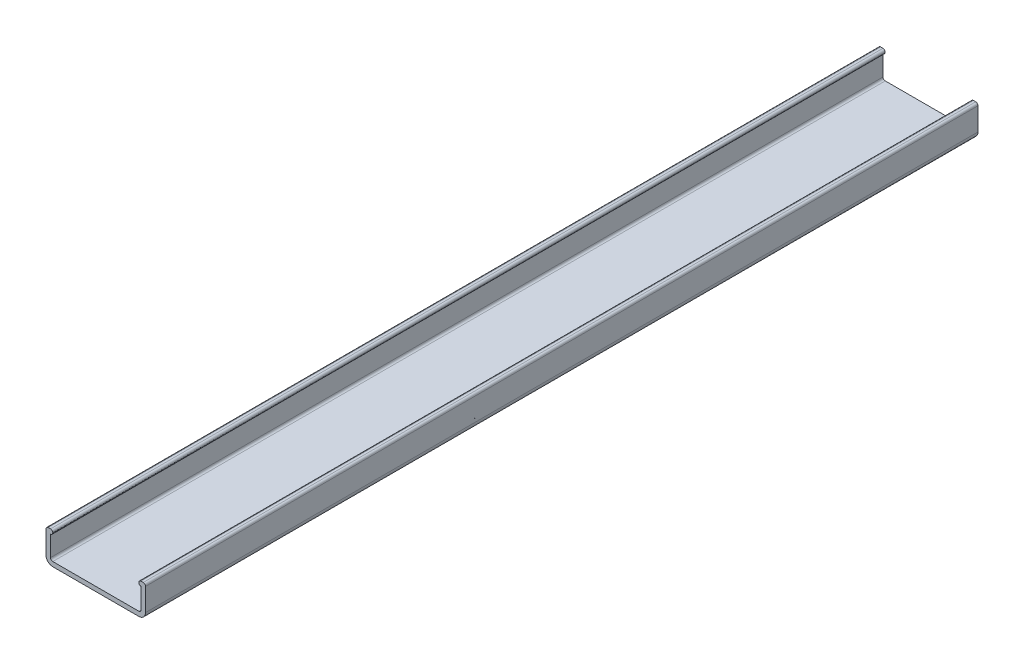
ISO-10303-21;
HEADER;
FILE_DESCRIPTION(('STEP AP214'),'2;1');
FILE_NAME('part.step','',(''),(''),'','','');
FILE_SCHEMA(('AUTOMOTIVE_DESIGN { 1 0 10303 214 1 1 1 1 }'));
ENDSEC;
DATA;
#1=APPLICATION_CONTEXT('core data for automotive mechanical design processes');
#2=APPLICATION_PROTOCOL_DEFINITION('international standard','automotive_design',2000,#1);
#3=PRODUCT_CONTEXT('',#1,'mechanical');
#4=PRODUCT('Part','Part','',(#3));
#5=PRODUCT_RELATED_PRODUCT_CATEGORY('part','',(#4));
#6=PRODUCT_DEFINITION_FORMATION('','',#4);
#7=PRODUCT_DEFINITION_CONTEXT('part definition',#1,'design');
#8=PRODUCT_DEFINITION('design','',#6,#7);
#9=PRODUCT_DEFINITION_SHAPE('','',#8);
#10=(LENGTH_UNIT() NAMED_UNIT(*) SI_UNIT(.MILLI.,.METRE.));
#11=(NAMED_UNIT(*) PLANE_ANGLE_UNIT() SI_UNIT($,.RADIAN.));
#12=(NAMED_UNIT(*) SI_UNIT($,.STERADIAN.) SOLID_ANGLE_UNIT());
#13=UNCERTAINTY_MEASURE_WITH_UNIT(LENGTH_MEASURE(1.E-05),#10,'distance_accuracy_value','');
#14=(GEOMETRIC_REPRESENTATION_CONTEXT(3) GLOBAL_UNCERTAINTY_ASSIGNED_CONTEXT((#13)) GLOBAL_UNIT_ASSIGNED_CONTEXT((#10,
#11,#12)) REPRESENTATION_CONTEXT('',''));
#15=CARTESIAN_POINT('',(0.,0.,0.));
#16=DIRECTION('',(0.,0.,1.));
#17=DIRECTION('',(1.,0.,0.));
#18=AXIS2_PLACEMENT_3D('',#15,#16,#17);
#19=CARTESIAN_POINT('',(-17.4625,11.1125,292.1));
#20=DIRECTION('',(0.,-1.,0.));
#21=DIRECTION('',(0.,0.,-1.));
#22=AXIS2_PLACEMENT_3D('',#19,#20,#21);
#23=PLANE('',#22);
#24=DIRECTION('',(-1.,0.,0.));
#25=VECTOR('',#24,1.);
#26=CARTESIAN_POINT('',(-17.4625,11.1125,292.1));
#27=LINE('',#26,#25);
#28=CARTESIAN_POINT('',(-15.875,11.1125,292.1));
#29=VERTEX_POINT('',#28);
#30=CARTESIAN_POINT('',(-16.66875,11.1125,292.1));
#31=VERTEX_POINT('',#30);
#32=EDGE_CURVE('E299',#29,#31,#27,.T.);
#33=ORIENTED_EDGE('',*,*,#32,.F.);
#34=DIRECTION('',(0.,0.,-1.));
#35=VECTOR('',#34,1.);
#36=CARTESIAN_POINT('',(-15.875,11.1125,292.1));
#37=LINE('',#36,#35);
#38=CARTESIAN_POINT('',(-15.875,11.1125,0.));
#39=VERTEX_POINT('',#38);
#40=EDGE_CURVE('E215',#29,#39,#37,.T.);
#41=ORIENTED_EDGE('',*,*,#40,.T.);
#42=DIRECTION('',(-1.,0.,0.));
#43=VECTOR('',#42,1.);
#44=CARTESIAN_POINT('',(-17.4625,11.1125,0.));
#45=LINE('',#44,#43);
#46=CARTESIAN_POINT('',(-16.66875,11.1125,0.));
#47=VERTEX_POINT('',#46);
#48=EDGE_CURVE('E250',#39,#47,#45,.T.);
#49=ORIENTED_EDGE('',*,*,#48,.T.);
#50=DIRECTION('',(0.,0.,-1.));
#51=VECTOR('',#50,1.);
#52=CARTESIAN_POINT('',(-16.66875,11.1125,292.1));
#53=LINE('',#52,#51);
#54=EDGE_CURVE('E213',#47,#31,#53,.F.);
#55=ORIENTED_EDGE('',*,*,#54,.T.);
#56=EDGE_LOOP('',(#33,#41,#49,#55));
#57=FACE_BOUND('',#56,.T.);
#58=ADVANCED_FACE('F33',(#57),#23,.F.);
#59=CARTESIAN_POINT('',(-17.4625,11.1125,292.1));
#60=DIRECTION('',(1.,0.,0.));
#61=DIRECTION('',(0.,1.,0.));
#62=AXIS2_PLACEMENT_3D('',#59,#60,#61);
#63=PLANE('',#62);
#64=DIRECTION('',(0.,-1.,0.));
#65=VECTOR('',#64,1.);
#66=CARTESIAN_POINT('',(-17.4625,11.1125,0.));
#67=LINE('',#66,#65);
#68=CARTESIAN_POINT('',(-17.4625,10.31875,0.));
#69=VERTEX_POINT('',#68);
#70=CARTESIAN_POINT('',(-17.4625,2.3495,0.));
#71=VERTEX_POINT('',#70);
#72=EDGE_CURVE('E284',#69,#71,#67,.T.);
#73=ORIENTED_EDGE('',*,*,#72,.T.);
#74=DIRECTION('',(0.,0.,-1.));
#75=VECTOR('',#74,1.);
#76=CARTESIAN_POINT('',(-17.4625,2.3495,292.1));
#77=LINE('',#76,#75);
#78=CARTESIAN_POINT('',(-17.4625,2.3495,292.1));
#79=VERTEX_POINT('',#78);
#80=EDGE_CURVE('E11',#71,#79,#77,.F.);
#81=ORIENTED_EDGE('',*,*,#80,.T.);
#82=DIRECTION('',(0.,-1.,0.));
#83=VECTOR('',#82,1.);
#84=CARTESIAN_POINT('',(-17.4625,11.1125,292.1));
#85=LINE('',#84,#83);
#86=CARTESIAN_POINT('',(-17.4625,10.31875,292.1));
#87=VERTEX_POINT('',#86);
#88=EDGE_CURVE('E304',#87,#79,#85,.T.);
#89=ORIENTED_EDGE('',*,*,#88,.F.);
#90=DIRECTION('',(0.,0.,-1.));
#91=VECTOR('',#90,1.);
#92=CARTESIAN_POINT('',(-17.4625,10.31875,292.1));
#93=LINE('',#92,#91);
#94=EDGE_CURVE('E217',#87,#69,#93,.T.);
#95=ORIENTED_EDGE('',*,*,#94,.T.);
#96=EDGE_LOOP('',(#73,#81,#89,#95));
#97=FACE_BOUND('',#96,.T.);
#98=ADVANCED_FACE('F325',(#97),#63,.F.);
#99=CARTESIAN_POINT('',(-17.4625,0.,292.1));
#100=DIRECTION('',(0.,1.,0.));
#101=DIRECTION('',(0.,0.,1.));
#102=AXIS2_PLACEMENT_3D('',#99,#100,#101);
#103=PLANE('',#102);
#104=DIRECTION('',(1.,0.,0.));
#105=VECTOR('',#104,1.);
#106=CARTESIAN_POINT('',(-17.4625,0.,0.));
#107=LINE('',#106,#105);
#108=CARTESIAN_POINT('',(-15.113,0.,0.));
#109=VERTEX_POINT('',#108);
#110=CARTESIAN_POINT('',(15.113,0.,0.));
#111=VERTEX_POINT('',#110);
#112=EDGE_CURVE('E280',#109,#111,#107,.T.);
#113=ORIENTED_EDGE('',*,*,#112,.T.);
#114=DIRECTION('',(0.,0.,-1.));
#115=VECTOR('',#114,1.);
#116=CARTESIAN_POINT('',(15.113,0.,292.1));
#117=LINE('',#116,#115);
#118=CARTESIAN_POINT('',(15.113,0.,292.1));
#119=VERTEX_POINT('',#118);
#120=EDGE_CURVE('E54',#111,#119,#117,.F.);
#121=ORIENTED_EDGE('',*,*,#120,.T.);
#122=DIRECTION('',(1.,0.,0.));
#123=VECTOR('',#122,1.);
#124=CARTESIAN_POINT('',(-17.4625,0.,292.1));
#125=LINE('',#124,#123);
#126=CARTESIAN_POINT('',(-15.113,0.,292.1));
#127=VERTEX_POINT('',#126);
#128=EDGE_CURVE('E267',#127,#119,#125,.T.);
#129=ORIENTED_EDGE('',*,*,#128,.F.);
#130=DIRECTION('',(0.,0.,-1.));
#131=VECTOR('',#130,1.);
#132=CARTESIAN_POINT('',(-15.113,0.,292.1));
#133=LINE('',#132,#131);
#134=EDGE_CURVE('E259',#127,#109,#133,.T.);
#135=ORIENTED_EDGE('',*,*,#134,.T.);
#136=EDGE_LOOP('',(#113,#121,#129,#135));
#137=FACE_BOUND('',#136,.T.);
#138=ADVANCED_FACE('F282',(#137),#103,.F.);
#139=CARTESIAN_POINT('',(17.4625,0.,292.1));
#140=DIRECTION('',(-1.,0.,0.));
#141=DIRECTION('',(0.,-1.,0.));
#142=AXIS2_PLACEMENT_3D('',#139,#140,#141);
#143=PLANE('',#142);
#144=DIRECTION('',(0.,1.,0.));
#145=VECTOR('',#144,1.);
#146=CARTESIAN_POINT('',(17.4625,0.,292.1));
#147=LINE('',#146,#145);
#148=CARTESIAN_POINT('',(17.4625,2.3495,292.1));
#149=VERTEX_POINT('',#148);
#150=CARTESIAN_POINT('',(17.4625,10.31875,292.1));
#151=VERTEX_POINT('',#150);
#152=EDGE_CURVE('E266',#149,#151,#147,.T.);
#153=ORIENTED_EDGE('',*,*,#152,.F.);
#154=DIRECTION('',(0.,0.,-1.));
#155=VECTOR('',#154,1.);
#156=CARTESIAN_POINT('',(17.4625,2.3495,292.1));
#157=LINE('',#156,#155);
#158=CARTESIAN_POINT('',(17.4625,2.3495,0.));
#159=VERTEX_POINT('',#158);
#160=EDGE_CURVE('E246',#149,#159,#157,.T.);
#161=ORIENTED_EDGE('',*,*,#160,.T.);
#162=DIRECTION('',(0.,1.,0.));
#163=VECTOR('',#162,1.);
#164=CARTESIAN_POINT('',(17.4625,0.,0.));
#165=LINE('',#164,#163);
#166=CARTESIAN_POINT('',(17.4625,10.31875,0.));
#167=VERTEX_POINT('',#166);
#168=EDGE_CURVE('E281',#159,#167,#165,.T.);
#169=ORIENTED_EDGE('',*,*,#168,.T.);
#170=DIRECTION('',(0.,0.,-1.));
#171=VECTOR('',#170,1.);
#172=CARTESIAN_POINT('',(17.4625,10.31875,292.1));
#173=LINE('',#172,#171);
#174=EDGE_CURVE('E226',#167,#151,#173,.F.);
#175=ORIENTED_EDGE('',*,*,#174,.T.);
#176=EDGE_LOOP('',(#153,#161,#169,#175));
#177=FACE_BOUND('',#176,.T.);
#178=ADVANCED_FACE('F271',(#177),#143,.F.);
#179=CARTESIAN_POINT('',(15.08125,11.1125,292.1));
#180=DIRECTION('',(0.,-1.,0.));
#181=DIRECTION('',(0.,0.,-1.));
#182=AXIS2_PLACEMENT_3D('',#179,#180,#181);
#183=PLANE('',#182);
#184=DIRECTION('',(-1.,0.,0.));
#185=VECTOR('',#184,1.);
#186=CARTESIAN_POINT('',(15.08125,11.1125,292.1));
#187=LINE('',#186,#185);
#188=CARTESIAN_POINT('',(16.66875,11.1125,292.1));
#189=VERTEX_POINT('',#188);
#190=CARTESIAN_POINT('',(15.875,11.1125,292.1));
#191=VERTEX_POINT('',#190);
#192=EDGE_CURVE('E181',#189,#191,#187,.T.);
#193=ORIENTED_EDGE('',*,*,#192,.F.);
#194=DIRECTION('',(0.,0.,-1.));
#195=VECTOR('',#194,1.);
#196=CARTESIAN_POINT('',(16.66875,11.1125,292.1));
#197=LINE('',#196,#195);
#198=CARTESIAN_POINT('',(16.66875,11.1125,0.));
#199=VERTEX_POINT('',#198);
#200=EDGE_CURVE('E223',#189,#199,#197,.T.);
#201=ORIENTED_EDGE('',*,*,#200,.T.);
#202=DIRECTION('',(-1.,0.,0.));
#203=VECTOR('',#202,1.);
#204=CARTESIAN_POINT('',(15.08125,11.1125,0.));
#205=LINE('',#204,#203);
#206=CARTESIAN_POINT('',(15.875,11.1125,0.));
#207=VERTEX_POINT('',#206);
#208=EDGE_CURVE('E286',#199,#207,#205,.T.);
#209=ORIENTED_EDGE('',*,*,#208,.T.);
#210=DIRECTION('',(0.,0.,-1.));
#211=VECTOR('',#210,1.);
#212=CARTESIAN_POINT('',(15.875,11.1125,292.1));
#213=LINE('',#212,#211);
#214=EDGE_CURVE('E220',#207,#191,#213,.F.);
#215=ORIENTED_EDGE('',*,*,#214,.T.);
#216=EDGE_LOOP('',(#193,#201,#209,#215));
#217=FACE_BOUND('',#216,.T.);
#218=ADVANCED_FACE('F387',(#217),#183,.F.);
#219=CARTESIAN_POINT('',(15.875,1.5875,292.1));
#220=DIRECTION('',(1.,0.,0.));
#221=DIRECTION('',(0.,1.,0.));
#222=AXIS2_PLACEMENT_3D('',#219,#220,#221);
#223=PLANE('',#222);
#224=DIRECTION('',(0.,-1.,0.));
#225=VECTOR('',#224,1.);
#226=CARTESIAN_POINT('',(15.875,1.5875,0.));
#227=LINE('',#226,#225);
#228=CARTESIAN_POINT('',(15.875,9.525,0.));
#229=VERTEX_POINT('',#228);
#230=CARTESIAN_POINT('',(15.875,2.38125,0.));
#231=VERTEX_POINT('',#230);
#232=EDGE_CURVE('E293',#229,#231,#227,.T.);
#233=ORIENTED_EDGE('',*,*,#232,.T.);
#234=DIRECTION('',(0.,0.,-1.));
#235=VECTOR('',#234,1.);
#236=CARTESIAN_POINT('',(15.875,2.38125,292.1));
#237=LINE('',#236,#235);
#238=CARTESIAN_POINT('',(15.875,2.38125,292.1));
#239=VERTEX_POINT('',#238);
#240=EDGE_CURVE('E179',#231,#239,#237,.F.);
#241=ORIENTED_EDGE('',*,*,#240,.T.);
#242=DIRECTION('',(0.,-1.,0.));
#243=VECTOR('',#242,1.);
#244=CARTESIAN_POINT('',(15.875,1.5875,292.1));
#245=LINE('',#244,#243);
#246=CARTESIAN_POINT('',(15.875,9.525,292.1));
#247=VERTEX_POINT('',#246);
#248=EDGE_CURVE('E163',#247,#239,#245,.T.);
#249=ORIENTED_EDGE('',*,*,#248,.F.);
#250=DIRECTION('',(0.,0.,-1.));
#251=VECTOR('',#250,1.);
#252=CARTESIAN_POINT('',(15.875,9.525,292.1));
#253=LINE('',#252,#251);
#254=EDGE_CURVE('E176',#247,#229,#253,.T.);
#255=ORIENTED_EDGE('',*,*,#254,.T.);
#256=EDGE_LOOP('',(#233,#241,#249,#255));
#257=FACE_BOUND('',#256,.T.);
#258=ADVANCED_FACE('F175',(#257),#223,.F.);
#259=CARTESIAN_POINT('',(-15.875,1.5875,292.1));
#260=DIRECTION('',(0.,-1.,0.));
#261=DIRECTION('',(0.,0.,-1.));
#262=AXIS2_PLACEMENT_3D('',#259,#260,#261);
#263=PLANE('',#262);
#264=DIRECTION('',(-1.,0.,0.));
#265=VECTOR('',#264,1.);
#266=CARTESIAN_POINT('',(-15.875,1.5875,292.1));
#267=LINE('',#266,#265);
#268=CARTESIAN_POINT('',(15.08125,1.5875,292.1));
#269=VERTEX_POINT('',#268);
#270=CARTESIAN_POINT('',(-15.08125,1.5875,292.1));
#271=VERTEX_POINT('',#270);
#272=EDGE_CURVE('E180',#269,#271,#267,.T.);
#273=ORIENTED_EDGE('',*,*,#272,.F.);
#274=DIRECTION('',(0.,0.,-1.));
#275=VECTOR('',#274,1.);
#276=CARTESIAN_POINT('',(15.08125,1.5875,0.));
#277=LINE('',#276,#275);
#278=CARTESIAN_POINT('',(15.08125,1.5875,0.));
#279=VERTEX_POINT('',#278);
#280=EDGE_CURVE('E231',#269,#279,#277,.T.);
#281=ORIENTED_EDGE('',*,*,#280,.T.);
#282=DIRECTION('',(-1.,0.,0.));
#283=VECTOR('',#282,1.);
#284=CARTESIAN_POINT('',(-15.875,1.5875,0.));
#285=LINE('',#284,#283);
#286=CARTESIAN_POINT('',(-15.08125,1.5875,0.));
#287=VERTEX_POINT('',#286);
#288=EDGE_CURVE('E295',#279,#287,#285,.T.);
#289=ORIENTED_EDGE('',*,*,#288,.T.);
#290=DIRECTION('',(0.,0.,-1.));
#291=VECTOR('',#290,1.);
#292=CARTESIAN_POINT('',(-15.08125,1.5875,292.1));
#293=LINE('',#292,#291);
#294=EDGE_CURVE('E229',#287,#271,#293,.F.);
#295=ORIENTED_EDGE('',*,*,#294,.T.);
#296=EDGE_LOOP('',(#273,#281,#289,#295));
#297=FACE_BOUND('',#296,.T.);
#298=ADVANCED_FACE('F380',(#297),#263,.F.);
#299=CARTESIAN_POINT('',(-15.875,9.525,292.1));
#300=DIRECTION('',(-1.,0.,0.));
#301=DIRECTION('',(0.,-1.,0.));
#302=AXIS2_PLACEMENT_3D('',#299,#300,#301);
#303=PLANE('',#302);
#304=DIRECTION('',(0.,1.,0.));
#305=VECTOR('',#304,1.);
#306=CARTESIAN_POINT('',(-15.875,9.525,292.1));
#307=LINE('',#306,#305);
#308=CARTESIAN_POINT('',(-15.875,2.38125,292.1));
#309=VERTEX_POINT('',#308);
#310=CARTESIAN_POINT('',(-15.875,9.525,292.1));
#311=VERTEX_POINT('',#310);
#312=EDGE_CURVE('E191',#309,#311,#307,.T.);
#313=ORIENTED_EDGE('',*,*,#312,.F.);
#314=DIRECTION('',(0.,0.,-1.));
#315=VECTOR('',#314,1.);
#316=CARTESIAN_POINT('',(-15.875,2.38125,0.));
#317=LINE('',#316,#315);
#318=CARTESIAN_POINT('',(-15.875,2.38125,0.));
#319=VERTEX_POINT('',#318);
#320=EDGE_CURVE('E235',#309,#319,#317,.T.);
#321=ORIENTED_EDGE('',*,*,#320,.T.);
#322=DIRECTION('',(0.,1.,0.));
#323=VECTOR('',#322,1.);
#324=CARTESIAN_POINT('',(-15.875,9.525,0.));
#325=LINE('',#324,#323);
#326=CARTESIAN_POINT('',(-15.875,9.525,0.));
#327=VERTEX_POINT('',#326);
#328=EDGE_CURVE('E297',#319,#327,#325,.T.);
#329=ORIENTED_EDGE('',*,*,#328,.T.);
#330=DIRECTION('',(0.,0.,-1.));
#331=VECTOR('',#330,1.);
#332=CARTESIAN_POINT('',(-15.875,9.525,292.1));
#333=LINE('',#332,#331);
#334=EDGE_CURVE('E186',#311,#327,#333,.T.);
#335=ORIENTED_EDGE('',*,*,#334,.F.);
#336=EDGE_LOOP('',(#313,#321,#329,#335));
#337=FACE_BOUND('',#336,.T.);
#338=ADVANCED_FACE('F374',(#337),#303,.F.);
#339=CARTESIAN_POINT('',(0.,0.,292.1));
#340=DIRECTION('',(0.,0.,-1.));
#341=DIRECTION('',(-1.,0.,0.));
#342=AXIS2_PLACEMENT_3D('',#339,#340,#341);
#343=PLANE('',#342);
#344=ORIENTED_EDGE('',*,*,#128,.T.);
#345=CARTESIAN_POINT('',(15.113,2.3495,292.1));
#346=DIRECTION('',(0.,0.,-1.));
#347=DIRECTION('',(-1.,0.,0.));
#348=AXIS2_PLACEMENT_3D('',#345,#346,#347);
#349=CIRCLE('',#348,2.3495);
#350=EDGE_CURVE('E41',#119,#149,#349,.F.);
#351=ORIENTED_EDGE('',*,*,#350,.T.);
#352=ORIENTED_EDGE('',*,*,#152,.T.);
#353=CARTESIAN_POINT('',(16.66875,10.31875,292.1));
#354=DIRECTION('',(0.,0.,-1.));
#355=DIRECTION('',(-1.,0.,0.));
#356=AXIS2_PLACEMENT_3D('',#353,#354,#355);
#357=CIRCLE('',#356,0.79375);
#358=EDGE_CURVE('E205',#151,#189,#357,.F.);
#359=ORIENTED_EDGE('',*,*,#358,.T.);
#360=ORIENTED_EDGE('',*,*,#192,.T.);
#361=CARTESIAN_POINT('',(15.875,10.31875,292.1));
#362=DIRECTION('',(0.,0.,-1.));
#363=DIRECTION('',(-1.,0.,0.));
#364=AXIS2_PLACEMENT_3D('',#361,#362,#363);
#365=CIRCLE('',#364,0.79375);
#366=CARTESIAN_POINT('',(15.08125,10.31875,292.1));
#367=VERTEX_POINT('',#366);
#368=EDGE_CURVE('E166',#191,#367,#365,.F.);
#369=ORIENTED_EDGE('',*,*,#368,.T.);
#370=CARTESIAN_POINT('',(15.875,10.31875,292.1));
#371=DIRECTION('',(0.,0.,-1.));
#372=DIRECTION('',(-1.,0.,0.));
#373=AXIS2_PLACEMENT_3D('',#370,#371,#372);
#374=CIRCLE('',#373,0.79375);
#375=EDGE_CURVE('E160',#367,#247,#374,.F.);
#376=ORIENTED_EDGE('',*,*,#375,.T.);
#377=ORIENTED_EDGE('',*,*,#248,.T.);
#378=CARTESIAN_POINT('',(15.08125,2.38125,292.1));
#379=DIRECTION('',(0.,0.,-1.));
#380=DIRECTION('',(-1.,0.,0.));
#381=AXIS2_PLACEMENT_3D('',#378,#379,#380);
#382=CIRCLE('',#381,0.79375);
#383=EDGE_CURVE('E240',#239,#269,#382,.T.);
#384=ORIENTED_EDGE('',*,*,#383,.T.);
#385=ORIENTED_EDGE('',*,*,#272,.T.);
#386=CARTESIAN_POINT('',(-15.08125,2.38125,292.1));
#387=DIRECTION('',(0.,0.,-1.));
#388=DIRECTION('',(-1.,0.,0.));
#389=AXIS2_PLACEMENT_3D('',#386,#387,#388);
#390=CIRCLE('',#389,0.79375);
#391=EDGE_CURVE('E244',#271,#309,#390,.T.);
#392=ORIENTED_EDGE('',*,*,#391,.T.);
#393=ORIENTED_EDGE('',*,*,#312,.T.);
#394=CARTESIAN_POINT('',(-15.875,10.31875,292.1));
#395=DIRECTION('',(0.,0.,-1.));
#396=DIRECTION('',(-1.,0.,0.));
#397=AXIS2_PLACEMENT_3D('',#394,#395,#396);
#398=CIRCLE('',#397,0.79375);
#399=CARTESIAN_POINT('',(-15.08125,10.31875,292.1));
#400=VERTEX_POINT('',#399);
#401=EDGE_CURVE('E211',#311,#400,#398,.F.);
#402=ORIENTED_EDGE('',*,*,#401,.T.);
#403=CARTESIAN_POINT('',(-15.875,10.31875,292.1));
#404=DIRECTION('',(0.,0.,-1.));
#405=DIRECTION('',(-1.,0.,0.));
#406=AXIS2_PLACEMENT_3D('',#403,#404,#405);
#407=CIRCLE('',#406,0.79375);
#408=EDGE_CURVE('E209',#400,#29,#407,.F.);
#409=ORIENTED_EDGE('',*,*,#408,.T.);
#410=ORIENTED_EDGE('',*,*,#32,.T.);
#411=CARTESIAN_POINT('',(-16.66875,10.31875,292.1));
#412=DIRECTION('',(0.,0.,-1.));
#413=DIRECTION('',(-1.,0.,0.));
#414=AXIS2_PLACEMENT_3D('',#411,#412,#413);
#415=CIRCLE('',#414,0.79375);
#416=EDGE_CURVE('E207',#31,#87,#415,.F.);
#417=ORIENTED_EDGE('',*,*,#416,.T.);
#418=ORIENTED_EDGE('',*,*,#88,.T.);
#419=CARTESIAN_POINT('',(-15.113,2.3495,292.1));
#420=DIRECTION('',(0.,0.,-1.));
#421=DIRECTION('',(-1.,0.,0.));
#422=AXIS2_PLACEMENT_3D('',#419,#420,#421);
#423=CIRCLE('',#422,2.3495);
#424=EDGE_CURVE('E263',#79,#127,#423,.F.);
#425=ORIENTED_EDGE('',*,*,#424,.T.);
#426=EDGE_LOOP('',(#344,#351,#352,#359,#360,#369,#376,#377,#384,#385,#392,#393,#402,#409,#410,
#417,#418,#425));
#427=FACE_BOUND('',#426,.T.);
#428=ADVANCED_FACE('F162',(#427),#343,.F.);
#429=CARTESIAN_POINT('',(0.,0.,0.));
#430=DIRECTION('',(0.,0.,-1.));
#431=DIRECTION('',(-1.,0.,0.));
#432=AXIS2_PLACEMENT_3D('',#429,#430,#431);
#433=PLANE('',#432);
#434=ORIENTED_EDGE('',*,*,#168,.F.);
#435=CARTESIAN_POINT('',(15.113,2.3495,0.));
#436=DIRECTION('',(0.,0.,-1.));
#437=DIRECTION('',(-1.,0.,0.));
#438=AXIS2_PLACEMENT_3D('',#435,#436,#437);
#439=CIRCLE('',#438,2.3495);
#440=EDGE_CURVE('E257',#159,#111,#439,.T.);
#441=ORIENTED_EDGE('',*,*,#440,.T.);
#442=ORIENTED_EDGE('',*,*,#112,.F.);
#443=CARTESIAN_POINT('',(-15.113,2.3495,0.));
#444=DIRECTION('',(0.,0.,-1.));
#445=DIRECTION('',(-1.,0.,0.));
#446=AXIS2_PLACEMENT_3D('',#443,#444,#445);
#447=CIRCLE('',#446,2.3495);
#448=EDGE_CURVE('E255',#109,#71,#447,.T.);
#449=ORIENTED_EDGE('',*,*,#448,.T.);
#450=ORIENTED_EDGE('',*,*,#72,.F.);
#451=CARTESIAN_POINT('',(-16.66875,10.31875,0.));
#452=DIRECTION('',(0.,0.,-1.));
#453=DIRECTION('',(-1.,0.,0.));
#454=AXIS2_PLACEMENT_3D('',#451,#452,#453);
#455=CIRCLE('',#454,0.79375);
#456=EDGE_CURVE('E199',#69,#47,#455,.T.);
#457=ORIENTED_EDGE('',*,*,#456,.T.);
#458=ORIENTED_EDGE('',*,*,#48,.F.);
#459=CARTESIAN_POINT('',(-15.875,10.31875,0.));
#460=DIRECTION('',(0.,0.,-1.));
#461=DIRECTION('',(-1.,0.,0.));
#462=AXIS2_PLACEMENT_3D('',#459,#460,#461);
#463=CIRCLE('',#462,0.79375);
#464=CARTESIAN_POINT('',(-15.08125,10.31875,0.));
#465=VERTEX_POINT('',#464);
#466=EDGE_CURVE('E201',#39,#465,#463,.T.);
#467=ORIENTED_EDGE('',*,*,#466,.T.);
#468=CARTESIAN_POINT('',(-15.875,10.31875,0.));
#469=DIRECTION('',(0.,0.,-1.));
#470=DIRECTION('',(-1.,0.,0.));
#471=AXIS2_PLACEMENT_3D('',#468,#469,#470);
#472=CIRCLE('',#471,0.79375);
#473=EDGE_CURVE('E171',#465,#327,#472,.T.);
#474=ORIENTED_EDGE('',*,*,#473,.T.);
#475=ORIENTED_EDGE('',*,*,#328,.F.);
#476=CARTESIAN_POINT('',(-15.08125,2.38125,0.));
#477=DIRECTION('',(0.,0.,-1.));
#478=DIRECTION('',(-1.,0.,0.));
#479=AXIS2_PLACEMENT_3D('',#476,#477,#478);
#480=CIRCLE('',#479,0.79375);
#481=EDGE_CURVE('E242',#319,#287,#480,.F.);
#482=ORIENTED_EDGE('',*,*,#481,.T.);
#483=ORIENTED_EDGE('',*,*,#288,.F.);
#484=CARTESIAN_POINT('',(15.08125,2.38125,0.));
#485=DIRECTION('',(0.,0.,-1.));
#486=DIRECTION('',(-1.,0.,0.));
#487=AXIS2_PLACEMENT_3D('',#484,#485,#486);
#488=CIRCLE('',#487,0.79375);
#489=EDGE_CURVE('E238',#279,#231,#488,.F.);
#490=ORIENTED_EDGE('',*,*,#489,.T.);
#491=ORIENTED_EDGE('',*,*,#232,.F.);
#492=CARTESIAN_POINT('',(15.875,10.31875,0.));
#493=DIRECTION('',(0.,0.,-1.));
#494=DIRECTION('',(-1.,0.,0.));
#495=AXIS2_PLACEMENT_3D('',#492,#493,#494);
#496=CIRCLE('',#495,0.79375);
#497=CARTESIAN_POINT('',(15.08125,10.31875,0.));
#498=VERTEX_POINT('',#497);
#499=EDGE_CURVE('E185',#229,#498,#496,.T.);
#500=ORIENTED_EDGE('',*,*,#499,.T.);
#501=CARTESIAN_POINT('',(15.875,10.31875,0.));
#502=DIRECTION('',(0.,0.,-1.));
#503=DIRECTION('',(-1.,0.,0.));
#504=AXIS2_PLACEMENT_3D('',#501,#502,#503);
#505=CIRCLE('',#504,0.79375);
#506=EDGE_CURVE('E188',#498,#207,#505,.T.);
#507=ORIENTED_EDGE('',*,*,#506,.T.);
#508=ORIENTED_EDGE('',*,*,#208,.F.);
#509=CARTESIAN_POINT('',(16.66875,10.31875,0.));
#510=DIRECTION('',(0.,0.,-1.));
#511=DIRECTION('',(-1.,0.,0.));
#512=AXIS2_PLACEMENT_3D('',#509,#510,#511);
#513=CIRCLE('',#512,0.79375);
#514=EDGE_CURVE('E196',#199,#167,#513,.T.);
#515=ORIENTED_EDGE('',*,*,#514,.T.);
#516=EDGE_LOOP('',(#434,#441,#442,#449,#450,#457,#458,#467,#474,#475,#482,#483,#490,#491,#500,
#507,#508,#515));
#517=FACE_BOUND('',#516,.T.);
#518=ADVANCED_FACE('F279',(#517),#433,.T.);
#519=CARTESIAN_POINT('',(-15.875,10.31875,292.1));
#520=DIRECTION('',(0.,0.,-1.));
#521=DIRECTION('',(-1.,0.,0.));
#522=AXIS2_PLACEMENT_3D('',#519,#520,#521);
#523=CYLINDRICAL_SURFACE('',#522,0.79375);
#524=ORIENTED_EDGE('',*,*,#40,.F.);
#525=ORIENTED_EDGE('',*,*,#408,.F.);
#526=DIRECTION('',(0.,0.,-1.));
#527=VECTOR('',#526,1.);
#528=CARTESIAN_POINT('',(-15.08125,10.31875,292.1));
#529=LINE('',#528,#527);
#530=EDGE_CURVE('E247',#465,#400,#529,.F.);
#531=ORIENTED_EDGE('',*,*,#530,.F.);
#532=ORIENTED_EDGE('',*,*,#466,.F.);
#533=EDGE_LOOP('',(#524,#525,#531,#532));
#534=FACE_BOUND('',#533,.T.);
#535=ADVANCED_FACE('F344',(#534),#523,.T.);
#536=CARTESIAN_POINT('',(-15.875,10.31875,292.1));
#537=DIRECTION('',(0.,0.,-1.));
#538=DIRECTION('',(-1.,0.,0.));
#539=AXIS2_PLACEMENT_3D('',#536,#537,#538);
#540=CYLINDRICAL_SURFACE('',#539,0.79375);
#541=ORIENTED_EDGE('',*,*,#401,.F.);
#542=ORIENTED_EDGE('',*,*,#334,.T.);
#543=ORIENTED_EDGE('',*,*,#473,.F.);
#544=ORIENTED_EDGE('',*,*,#530,.T.);
#545=EDGE_LOOP('',(#541,#542,#543,#544));
#546=FACE_BOUND('',#545,.T.);
#547=ADVANCED_FACE('F341',(#546),#540,.T.);
#548=CARTESIAN_POINT('',(-16.66875,10.31875,292.1));
#549=DIRECTION('',(0.,0.,-1.));
#550=DIRECTION('',(-1.,0.,0.));
#551=AXIS2_PLACEMENT_3D('',#548,#549,#550);
#552=CYLINDRICAL_SURFACE('',#551,0.79375);
#553=ORIENTED_EDGE('',*,*,#416,.F.);
#554=ORIENTED_EDGE('',*,*,#54,.F.);
#555=ORIENTED_EDGE('',*,*,#456,.F.);
#556=ORIENTED_EDGE('',*,*,#94,.F.);
#557=EDGE_LOOP('',(#553,#554,#555,#556));
#558=FACE_BOUND('',#557,.T.);
#559=ADVANCED_FACE('F322',(#558),#552,.T.);
#560=CARTESIAN_POINT('',(16.66875,10.31875,292.1));
#561=DIRECTION('',(0.,0.,-1.));
#562=DIRECTION('',(-1.,0.,0.));
#563=AXIS2_PLACEMENT_3D('',#560,#561,#562);
#564=CYLINDRICAL_SURFACE('',#563,0.79375);
#565=ORIENTED_EDGE('',*,*,#358,.F.);
#566=ORIENTED_EDGE('',*,*,#174,.F.);
#567=ORIENTED_EDGE('',*,*,#514,.F.);
#568=ORIENTED_EDGE('',*,*,#200,.F.);
#569=EDGE_LOOP('',(#565,#566,#567,#568));
#570=FACE_BOUND('',#569,.T.);
#571=ADVANCED_FACE('F351',(#570),#564,.T.);
#572=CARTESIAN_POINT('',(15.875,10.31875,292.1));
#573=DIRECTION('',(0.,0.,-1.));
#574=DIRECTION('',(-1.,0.,0.));
#575=AXIS2_PLACEMENT_3D('',#572,#573,#574);
#576=CYLINDRICAL_SURFACE('',#575,0.79375);
#577=ORIENTED_EDGE('',*,*,#254,.F.);
#578=ORIENTED_EDGE('',*,*,#375,.F.);
#579=DIRECTION('',(0.,0.,-1.));
#580=VECTOR('',#579,1.);
#581=CARTESIAN_POINT('',(15.08125,10.31875,292.1));
#582=LINE('',#581,#580);
#583=EDGE_CURVE('E251',#498,#367,#582,.F.);
#584=ORIENTED_EDGE('',*,*,#583,.F.);
#585=ORIENTED_EDGE('',*,*,#499,.F.);
#586=EDGE_LOOP('',(#577,#578,#584,#585));
#587=FACE_BOUND('',#586,.T.);
#588=ADVANCED_FACE('F184',(#587),#576,.T.);
#589=CARTESIAN_POINT('',(15.875,10.31875,292.1));
#590=DIRECTION('',(0.,0.,-1.));
#591=DIRECTION('',(-1.,0.,0.));
#592=AXIS2_PLACEMENT_3D('',#589,#590,#591);
#593=CYLINDRICAL_SURFACE('',#592,0.79375);
#594=ORIENTED_EDGE('',*,*,#368,.F.);
#595=ORIENTED_EDGE('',*,*,#214,.F.);
#596=ORIENTED_EDGE('',*,*,#506,.F.);
#597=ORIENTED_EDGE('',*,*,#583,.T.);
#598=EDGE_LOOP('',(#594,#595,#596,#597));
#599=FACE_BOUND('',#598,.T.);
#600=ADVANCED_FACE('F355',(#599),#593,.T.);
#601=CARTESIAN_POINT('',(15.08125,2.38125,292.1));
#602=DIRECTION('',(0.,0.,1.));
#603=DIRECTION('',(1.,0.,0.));
#604=AXIS2_PLACEMENT_3D('',#601,#602,#603);
#605=CYLINDRICAL_SURFACE('',#604,0.79375);
#606=ORIENTED_EDGE('',*,*,#383,.F.);
#607=ORIENTED_EDGE('',*,*,#240,.F.);
#608=ORIENTED_EDGE('',*,*,#489,.F.);
#609=ORIENTED_EDGE('',*,*,#280,.F.);
#610=EDGE_LOOP('',(#606,#607,#608,#609));
#611=FACE_BOUND('',#610,.T.);
#612=ADVANCED_FACE('F358',(#611),#605,.F.);
#613=CARTESIAN_POINT('',(-15.08125,2.38125,292.1));
#614=DIRECTION('',(0.,0.,1.));
#615=DIRECTION('',(1.,0.,0.));
#616=AXIS2_PLACEMENT_3D('',#613,#614,#615);
#617=CYLINDRICAL_SURFACE('',#616,0.79375);
#618=ORIENTED_EDGE('',*,*,#391,.F.);
#619=ORIENTED_EDGE('',*,*,#294,.F.);
#620=ORIENTED_EDGE('',*,*,#481,.F.);
#621=ORIENTED_EDGE('',*,*,#320,.F.);
#622=EDGE_LOOP('',(#618,#619,#620,#621));
#623=FACE_BOUND('',#622,.T.);
#624=ADVANCED_FACE('F332',(#623),#617,.F.);
#625=CARTESIAN_POINT('',(15.113,2.3495,292.1));
#626=DIRECTION('',(0.,0.,-1.));
#627=DIRECTION('',(-1.,0.,0.));
#628=AXIS2_PLACEMENT_3D('',#625,#626,#627);
#629=CYLINDRICAL_SURFACE('',#628,2.3495);
#630=ORIENTED_EDGE('',*,*,#350,.F.);
#631=ORIENTED_EDGE('',*,*,#120,.F.);
#632=ORIENTED_EDGE('',*,*,#440,.F.);
#633=ORIENTED_EDGE('',*,*,#160,.F.);
#634=EDGE_LOOP('',(#630,#631,#632,#633));
#635=FACE_BOUND('',#634,.T.);
#636=ADVANCED_FACE('F276',(#635),#629,.T.);
#637=CARTESIAN_POINT('',(-15.113,2.3495,292.1));
#638=DIRECTION('',(0.,0.,-1.));
#639=DIRECTION('',(-1.,0.,0.));
#640=AXIS2_PLACEMENT_3D('',#637,#638,#639);
#641=CYLINDRICAL_SURFACE('',#640,2.3495);
#642=ORIENTED_EDGE('',*,*,#424,.F.);
#643=ORIENTED_EDGE('',*,*,#80,.F.);
#644=ORIENTED_EDGE('',*,*,#448,.F.);
#645=ORIENTED_EDGE('',*,*,#134,.F.);
#646=EDGE_LOOP('',(#642,#643,#644,#645));
#647=FACE_BOUND('',#646,.T.);
#648=ADVANCED_FACE('F35',(#647),#641,.T.);
#649=CLOSED_SHELL('',(#58,#98,#138,#178,#218,#258,#298,#338,#428,#518,#535,#547,#559,#571,#588,
#600,#612,#624,#636,#648));
#650=MANIFOLD_SOLID_BREP('B2',#649);
#651=ADVANCED_BREP_SHAPE_REPRESENTATION('',(#18,#650),#14);
#652=SHAPE_DEFINITION_REPRESENTATION(#9,#651);
ENDSEC;
END-ISO-10303-21;
